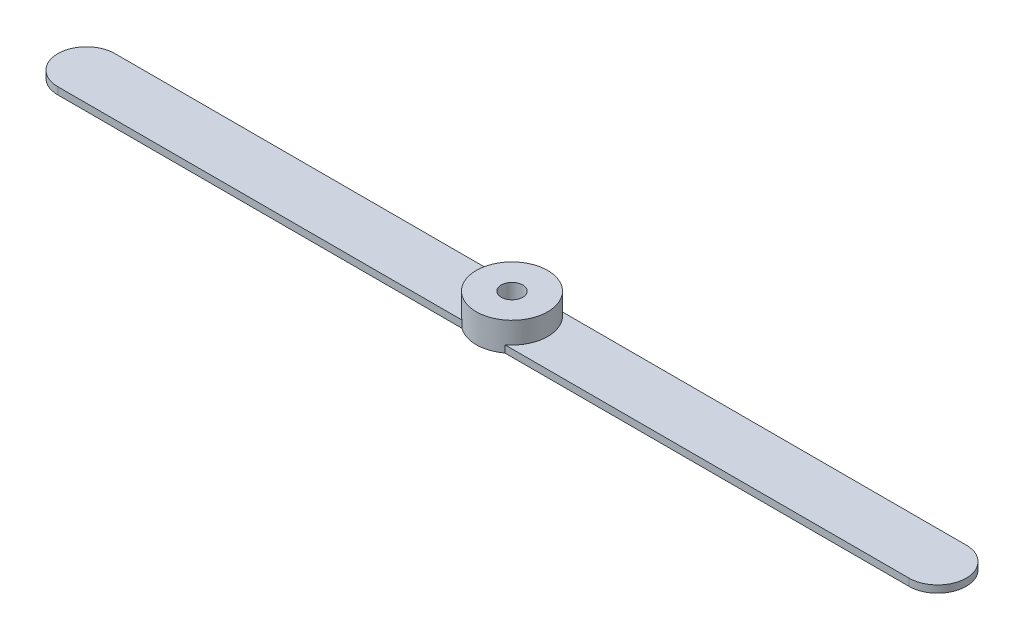
ISO-10303-21;
HEADER;
FILE_DESCRIPTION(('STEP AP214'),'2;1');
FILE_NAME('part.step','',(''),(''),'','','');
FILE_SCHEMA(('AUTOMOTIVE_DESIGN { 1 0 10303 214 1 1 1 1 }'));
ENDSEC;
DATA;
#1=APPLICATION_CONTEXT('core data for automotive mechanical design processes');
#2=APPLICATION_PROTOCOL_DEFINITION('international standard','automotive_design',2000,#1);
#3=PRODUCT_CONTEXT('',#1,'mechanical');
#4=PRODUCT('Part','Part','',(#3));
#5=PRODUCT_RELATED_PRODUCT_CATEGORY('part','',(#4));
#6=PRODUCT_DEFINITION_FORMATION('','',#4);
#7=PRODUCT_DEFINITION_CONTEXT('part definition',#1,'design');
#8=PRODUCT_DEFINITION('design','',#6,#7);
#9=PRODUCT_DEFINITION_SHAPE('','',#8);
#10=(LENGTH_UNIT() NAMED_UNIT(*) SI_UNIT(.MILLI.,.METRE.));
#11=(NAMED_UNIT(*) PLANE_ANGLE_UNIT() SI_UNIT($,.RADIAN.));
#12=(NAMED_UNIT(*) SI_UNIT($,.STERADIAN.) SOLID_ANGLE_UNIT());
#13=UNCERTAINTY_MEASURE_WITH_UNIT(LENGTH_MEASURE(1.E-05),#10,'distance_accuracy_value','');
#14=(GEOMETRIC_REPRESENTATION_CONTEXT(3) GLOBAL_UNCERTAINTY_ASSIGNED_CONTEXT((#13)) GLOBAL_UNIT_ASSIGNED_CONTEXT((#10,
#11,#12)) REPRESENTATION_CONTEXT('',''));
#15=CARTESIAN_POINT('',(0.,0.,0.));
#16=DIRECTION('',(0.,0.,1.));
#17=DIRECTION('',(1.,0.,0.));
#18=AXIS2_PLACEMENT_3D('',#15,#16,#17);
#19=CARTESIAN_POINT('',(0.,8.,0.));
#20=DIRECTION('',(0.,-1.,0.));
#21=DIRECTION('',(0.,0.,-1.));
#22=AXIS2_PLACEMENT_3D('',#19,#20,#21);
#23=CYLINDRICAL_SURFACE('',#22,10.);
#24=CARTESIAN_POINT('',(0.,8.,0.));
#25=DIRECTION('',(0.,1.,0.));
#26=DIRECTION('',(0.,0.,1.));
#27=AXIS2_PLACEMENT_3D('',#24,#25,#26);
#28=CIRCLE('',#27,10.);
#29=CARTESIAN_POINT('',(0.,8.,10.));
#30=VERTEX_POINT('',#29);
#31=EDGE_CURVE('E145',#30,#30,#28,.T.);
#32=ORIENTED_EDGE('',*,*,#31,.F.);
#33=EDGE_LOOP('',(#32));
#34=FACE_BOUND('',#33,.T.);
#35=DIRECTION('',(0.,-1.,0.));
#36=VECTOR('',#35,1.);
#37=CARTESIAN_POINT('',(6.00000000000003,8.,7.99999999999998));
#38=LINE('',#37,#36);
#39=CARTESIAN_POINT('',(6.00000000000003,2.,7.99999999999998));
#40=VERTEX_POINT('',#39);
#41=CARTESIAN_POINT('',(6.00000000000003,0.,7.99999999999998));
#42=VERTEX_POINT('',#41);
#43=EDGE_CURVE('E143',#40,#42,#38,.T.);
#44=ORIENTED_EDGE('',*,*,#43,.F.);
#45=CARTESIAN_POINT('',(0.,2.,0.));
#46=DIRECTION('',(0.,1.,0.));
#47=DIRECTION('',(0.,0.,1.));
#48=AXIS2_PLACEMENT_3D('',#45,#46,#47);
#49=CIRCLE('',#48,10.);
#50=CARTESIAN_POINT('',(5.99999999999997,2.,-8.00000000000002));
#51=VERTEX_POINT('',#50);
#52=EDGE_CURVE('E11',#40,#51,#49,.T.);
#53=ORIENTED_EDGE('',*,*,#52,.T.);
#54=DIRECTION('',(0.,-1.,0.));
#55=VECTOR('',#54,1.);
#56=CARTESIAN_POINT('',(5.99999999999997,8.,-8.00000000000002));
#57=LINE('',#56,#55);
#58=CARTESIAN_POINT('',(5.99999999999998,0.,-8.00000000000002));
#59=VERTEX_POINT('',#58);
#60=EDGE_CURVE('E129',#59,#51,#57,.F.);
#61=ORIENTED_EDGE('',*,*,#60,.F.);
#62=CARTESIAN_POINT('',(0.,0.,0.));
#63=DIRECTION('',(0.,1.,0.));
#64=DIRECTION('',(0.,0.,1.));
#65=AXIS2_PLACEMENT_3D('',#62,#63,#64);
#66=CIRCLE('',#65,10.);
#67=CARTESIAN_POINT('',(-5.99999999999998,0.,-8.00000000000002));
#68=VERTEX_POINT('',#67);
#69=EDGE_CURVE('E148',#59,#68,#66,.T.);
#70=ORIENTED_EDGE('',*,*,#69,.T.);
#71=DIRECTION('',(0.,-1.,0.));
#72=VECTOR('',#71,1.);
#73=CARTESIAN_POINT('',(-5.99999999999997,8.,-8.00000000000002));
#74=LINE('',#73,#72);
#75=CARTESIAN_POINT('',(-5.99999999999997,2.,-8.00000000000002));
#76=VERTEX_POINT('',#75);
#77=EDGE_CURVE('E131',#76,#68,#74,.T.);
#78=ORIENTED_EDGE('',*,*,#77,.F.);
#79=CARTESIAN_POINT('',(-6.00000000000003,2.,7.99999999999998));
#80=VERTEX_POINT('',#79);
#81=EDGE_CURVE('E46',#76,#80,#49,.T.);
#82=ORIENTED_EDGE('',*,*,#81,.T.);
#83=DIRECTION('',(0.,-1.,0.));
#84=VECTOR('',#83,1.);
#85=CARTESIAN_POINT('',(-6.00000000000003,8.,7.99999999999998));
#86=LINE('',#85,#84);
#87=CARTESIAN_POINT('',(-6.00000000000003,0.,7.99999999999998));
#88=VERTEX_POINT('',#87);
#89=EDGE_CURVE('E112',#88,#80,#86,.F.);
#90=ORIENTED_EDGE('',*,*,#89,.F.);
#91=EDGE_CURVE('E141',#88,#42,#66,.T.);
#92=ORIENTED_EDGE('',*,*,#91,.T.);
#93=EDGE_LOOP('',(#44,#53,#61,#70,#78,#82,#90,#92));
#94=FACE_BOUND('',#93,.T.);
#95=ADVANCED_FACE('F43',(#34,#94),#23,.T.);
#96=CARTESIAN_POINT('',(0.,8.,0.));
#97=DIRECTION('',(0.,1.,0.));
#98=DIRECTION('',(0.,0.,1.));
#99=AXIS2_PLACEMENT_3D('',#96,#97,#98);
#100=PLANE('',#99);
#101=CARTESIAN_POINT('',(0.,8.,0.));
#102=DIRECTION('',(0.,1.,0.));
#103=DIRECTION('',(0.,0.,1.));
#104=AXIS2_PLACEMENT_3D('',#101,#102,#103);
#105=CIRCLE('',#104,3.);
#106=CARTESIAN_POINT('',(0.,8.,3.));
#107=VERTEX_POINT('',#106);
#108=EDGE_CURVE('E178',#107,#107,#105,.T.);
#109=ORIENTED_EDGE('',*,*,#108,.F.);
#110=EDGE_LOOP('',(#109));
#111=FACE_BOUND('',#110,.T.);
#112=ORIENTED_EDGE('',*,*,#31,.T.);
#113=EDGE_LOOP('',(#112));
#114=FACE_BOUND('',#113,.T.);
#115=ADVANCED_FACE('F191',(#111,#114),#100,.T.);
#116=CARTESIAN_POINT('',(0.,0.,0.));
#117=DIRECTION('',(0.,1.,0.));
#118=DIRECTION('',(0.,0.,1.));
#119=AXIS2_PLACEMENT_3D('',#116,#117,#118);
#120=PLANE('',#119);
#121=CARTESIAN_POINT('',(0.,0.,0.));
#122=DIRECTION('',(0.,1.,0.));
#123=DIRECTION('',(0.,0.,1.));
#124=AXIS2_PLACEMENT_3D('',#121,#122,#123);
#125=CIRCLE('',#124,3.);
#126=CARTESIAN_POINT('',(0.,0.,3.));
#127=VERTEX_POINT('',#126);
#128=EDGE_CURVE('E183',#127,#127,#125,.T.);
#129=ORIENTED_EDGE('',*,*,#128,.T.);
#130=EDGE_LOOP('',(#129));
#131=FACE_BOUND('',#130,.T.);
#132=ORIENTED_EDGE('',*,*,#91,.F.);
#133=DIRECTION('',(1.,0.,0.));
#134=VECTOR('',#133,1.);
#135=CARTESIAN_POINT('',(-119.,0.,8.));
#136=LINE('',#135,#134);
#137=CARTESIAN_POINT('',(-119.,0.,8.));
#138=VERTEX_POINT('',#137);
#139=EDGE_CURVE('E163',#138,#88,#136,.T.);
#140=ORIENTED_EDGE('',*,*,#139,.F.);
#141=CARTESIAN_POINT('',(-119.,0.,0.));
#142=DIRECTION('',(0.,1.,0.));
#143=DIRECTION('',(0.,0.,1.));
#144=AXIS2_PLACEMENT_3D('',#141,#142,#143);
#145=CIRCLE('',#144,8.);
#146=CARTESIAN_POINT('',(-119.,0.,-8.));
#147=VERTEX_POINT('',#146);
#148=EDGE_CURVE('E126',#147,#138,#145,.T.);
#149=ORIENTED_EDGE('',*,*,#148,.F.);
#150=DIRECTION('',(-1.,0.,0.));
#151=VECTOR('',#150,1.);
#152=CARTESIAN_POINT('',(-119.,0.,-8.));
#153=LINE('',#152,#151);
#154=EDGE_CURVE('E159',#68,#147,#153,.T.);
#155=ORIENTED_EDGE('',*,*,#154,.F.);
#156=ORIENTED_EDGE('',*,*,#69,.F.);
#157=CARTESIAN_POINT('',(119.,0.,-8.00000000000004));
#158=VERTEX_POINT('',#157);
#159=EDGE_CURVE('E121',#158,#59,#153,.T.);
#160=ORIENTED_EDGE('',*,*,#159,.F.);
#161=CARTESIAN_POINT('',(119.,0.,0.));
#162=DIRECTION('',(0.,1.,0.));
#163=DIRECTION('',(0.,0.,1.));
#164=AXIS2_PLACEMENT_3D('',#161,#162,#163);
#165=CIRCLE('',#164,8.);
#166=CARTESIAN_POINT('',(119.,0.,7.99999999999996));
#167=VERTEX_POINT('',#166);
#168=EDGE_CURVE('E165',#167,#158,#165,.T.);
#169=ORIENTED_EDGE('',*,*,#168,.F.);
#170=EDGE_CURVE('E180',#42,#167,#136,.T.);
#171=ORIENTED_EDGE('',*,*,#170,.F.);
#172=EDGE_LOOP('',(#132,#140,#149,#155,#156,#160,#169,#171));
#173=FACE_BOUND('',#172,.T.);
#174=ADVANCED_FACE('F158',(#131,#173),#120,.F.);
#175=CARTESIAN_POINT('',(-119.,2.,0.));
#176=DIRECTION('',(0.,-1.,0.));
#177=DIRECTION('',(0.,0.,-1.));
#178=AXIS2_PLACEMENT_3D('',#175,#176,#177);
#179=CYLINDRICAL_SURFACE('',#178,8.);
#180=ORIENTED_EDGE('',*,*,#148,.T.);
#181=DIRECTION('',(0.,-1.,0.));
#182=VECTOR('',#181,1.);
#183=CARTESIAN_POINT('',(-119.,2.,8.));
#184=LINE('',#183,#182);
#185=CARTESIAN_POINT('',(-119.,2.,8.));
#186=VERTEX_POINT('',#185);
#187=EDGE_CURVE('E107',#186,#138,#184,.T.);
#188=ORIENTED_EDGE('',*,*,#187,.F.);
#189=CARTESIAN_POINT('',(-119.,2.,0.));
#190=DIRECTION('',(0.,1.,0.));
#191=DIRECTION('',(0.,0.,1.));
#192=AXIS2_PLACEMENT_3D('',#189,#190,#191);
#193=CIRCLE('',#192,8.);
#194=CARTESIAN_POINT('',(-119.,2.,-8.));
#195=VERTEX_POINT('',#194);
#196=EDGE_CURVE('E116',#195,#186,#193,.T.);
#197=ORIENTED_EDGE('',*,*,#196,.F.);
#198=DIRECTION('',(0.,-1.,0.));
#199=VECTOR('',#198,1.);
#200=CARTESIAN_POINT('',(-119.,2.,-8.));
#201=LINE('',#200,#199);
#202=EDGE_CURVE('E169',#195,#147,#201,.T.);
#203=ORIENTED_EDGE('',*,*,#202,.T.);
#204=EDGE_LOOP('',(#180,#188,#197,#203));
#205=FACE_BOUND('',#204,.T.);
#206=ADVANCED_FACE('F127',(#205),#179,.T.);
#207=CARTESIAN_POINT('',(-119.,2.,0.));
#208=DIRECTION('',(0.,1.,0.));
#209=DIRECTION('',(0.,0.,1.));
#210=AXIS2_PLACEMENT_3D('',#207,#208,#209);
#211=PLANE('',#210);
#212=ORIENTED_EDGE('',*,*,#81,.F.);
#213=DIRECTION('',(-1.,0.,0.));
#214=VECTOR('',#213,1.);
#215=CARTESIAN_POINT('',(-119.,2.,-8.));
#216=LINE('',#215,#214);
#217=EDGE_CURVE('E117',#76,#195,#216,.T.);
#218=ORIENTED_EDGE('',*,*,#217,.T.);
#219=ORIENTED_EDGE('',*,*,#196,.T.);
#220=DIRECTION('',(1.,0.,0.));
#221=VECTOR('',#220,1.);
#222=CARTESIAN_POINT('',(-119.,2.,8.));
#223=LINE('',#222,#221);
#224=EDGE_CURVE('E62',#186,#80,#223,.T.);
#225=ORIENTED_EDGE('',*,*,#224,.T.);
#226=EDGE_LOOP('',(#212,#218,#219,#225));
#227=FACE_BOUND('',#226,.T.);
#228=ADVANCED_FACE('F120',(#227),#211,.T.);
#229=CARTESIAN_POINT('',(-119.,2.,-8.));
#230=DIRECTION('',(0.,0.,1.));
#231=DIRECTION('',(1.,0.,0.));
#232=AXIS2_PLACEMENT_3D('',#229,#230,#231);
#233=PLANE('',#232);
#234=ORIENTED_EDGE('',*,*,#217,.F.);
#235=ORIENTED_EDGE('',*,*,#77,.T.);
#236=ORIENTED_EDGE('',*,*,#154,.T.);
#237=ORIENTED_EDGE('',*,*,#202,.F.);
#238=EDGE_LOOP('',(#234,#235,#236,#237));
#239=FACE_BOUND('',#238,.T.);
#240=ADVANCED_FACE('F218',(#239),#233,.F.);
#241=CARTESIAN_POINT('',(-119.,2.,8.));
#242=DIRECTION('',(0.,0.,-1.));
#243=DIRECTION('',(-1.,0.,0.));
#244=AXIS2_PLACEMENT_3D('',#241,#242,#243);
#245=PLANE('',#244);
#246=ORIENTED_EDGE('',*,*,#139,.T.);
#247=ORIENTED_EDGE('',*,*,#89,.T.);
#248=ORIENTED_EDGE('',*,*,#224,.F.);
#249=ORIENTED_EDGE('',*,*,#187,.T.);
#250=EDGE_LOOP('',(#246,#247,#248,#249));
#251=FACE_BOUND('',#250,.T.);
#252=ADVANCED_FACE('F106',(#251),#245,.F.);
#253=ORIENTED_EDGE('',*,*,#52,.F.);
#254=CARTESIAN_POINT('',(119.,2.,7.99999999999996));
#255=VERTEX_POINT('',#254);
#256=EDGE_CURVE('E111',#40,#255,#223,.T.);
#257=ORIENTED_EDGE('',*,*,#256,.T.);
#258=CARTESIAN_POINT('',(119.,2.,0.));
#259=DIRECTION('',(0.,1.,0.));
#260=DIRECTION('',(0.,0.,1.));
#261=AXIS2_PLACEMENT_3D('',#258,#259,#260);
#262=CIRCLE('',#261,8.);
#263=CARTESIAN_POINT('',(119.,2.,-8.00000000000004));
#264=VERTEX_POINT('',#263);
#265=EDGE_CURVE('E114',#255,#264,#262,.T.);
#266=ORIENTED_EDGE('',*,*,#265,.T.);
#267=EDGE_CURVE('E60',#264,#51,#216,.T.);
#268=ORIENTED_EDGE('',*,*,#267,.T.);
#269=EDGE_LOOP('',(#253,#257,#266,#268));
#270=FACE_BOUND('',#269,.T.);
#271=ADVANCED_FACE('F222',(#270),#211,.T.);
#272=ORIENTED_EDGE('',*,*,#256,.F.);
#273=ORIENTED_EDGE('',*,*,#43,.T.);
#274=ORIENTED_EDGE('',*,*,#170,.T.);
#275=DIRECTION('',(0.,-1.,0.));
#276=VECTOR('',#275,1.);
#277=CARTESIAN_POINT('',(119.,2.,7.99999999999996));
#278=LINE('',#277,#276);
#279=EDGE_CURVE('E128',#255,#167,#278,.T.);
#280=ORIENTED_EDGE('',*,*,#279,.F.);
#281=EDGE_LOOP('',(#272,#273,#274,#280));
#282=FACE_BOUND('',#281,.T.);
#283=ADVANCED_FACE('F237',(#282),#245,.F.);
#284=ORIENTED_EDGE('',*,*,#159,.T.);
#285=ORIENTED_EDGE('',*,*,#60,.T.);
#286=ORIENTED_EDGE('',*,*,#267,.F.);
#287=DIRECTION('',(0.,-1.,0.));
#288=VECTOR('',#287,1.);
#289=CARTESIAN_POINT('',(119.,2.,-8.00000000000004));
#290=LINE('',#289,#288);
#291=EDGE_CURVE('E132',#264,#158,#290,.T.);
#292=ORIENTED_EDGE('',*,*,#291,.T.);
#293=EDGE_LOOP('',(#284,#285,#286,#292));
#294=FACE_BOUND('',#293,.T.);
#295=ADVANCED_FACE('F171',(#294),#233,.F.);
#296=CARTESIAN_POINT('',(119.,2.,0.));
#297=DIRECTION('',(0.,-1.,0.));
#298=DIRECTION('',(0.,0.,-1.));
#299=AXIS2_PLACEMENT_3D('',#296,#297,#298);
#300=CYLINDRICAL_SURFACE('',#299,8.);
#301=ORIENTED_EDGE('',*,*,#168,.T.);
#302=ORIENTED_EDGE('',*,*,#291,.F.);
#303=ORIENTED_EDGE('',*,*,#265,.F.);
#304=ORIENTED_EDGE('',*,*,#279,.T.);
#305=EDGE_LOOP('',(#301,#302,#303,#304));
#306=FACE_BOUND('',#305,.T.);
#307=ADVANCED_FACE('F172',(#306),#300,.T.);
#308=CARTESIAN_POINT('',(0.,8.,0.));
#309=DIRECTION('',(0.,-1.,0.));
#310=DIRECTION('',(0.,0.,-1.));
#311=AXIS2_PLACEMENT_3D('',#308,#309,#310);
#312=CYLINDRICAL_SURFACE('',#311,3.);
#313=ORIENTED_EDGE('',*,*,#108,.T.);
#314=EDGE_LOOP('',(#313));
#315=FACE_BOUND('',#314,.T.);
#316=ORIENTED_EDGE('',*,*,#128,.F.);
#317=EDGE_LOOP('',(#316));
#318=FACE_BOUND('',#317,.T.);
#319=ADVANCED_FACE('F192',(#315,#318),#312,.F.);
#320=CLOSED_SHELL('',(#95,#115,#174,#206,#228,#240,#252,#271,#283,#295,#307,#319));
#321=MANIFOLD_SOLID_BREP('B2',#320);
#322=ADVANCED_BREP_SHAPE_REPRESENTATION('',(#18,#321),#14);
#323=SHAPE_DEFINITION_REPRESENTATION(#9,#322);
ENDSEC;
END-ISO-10303-21;
